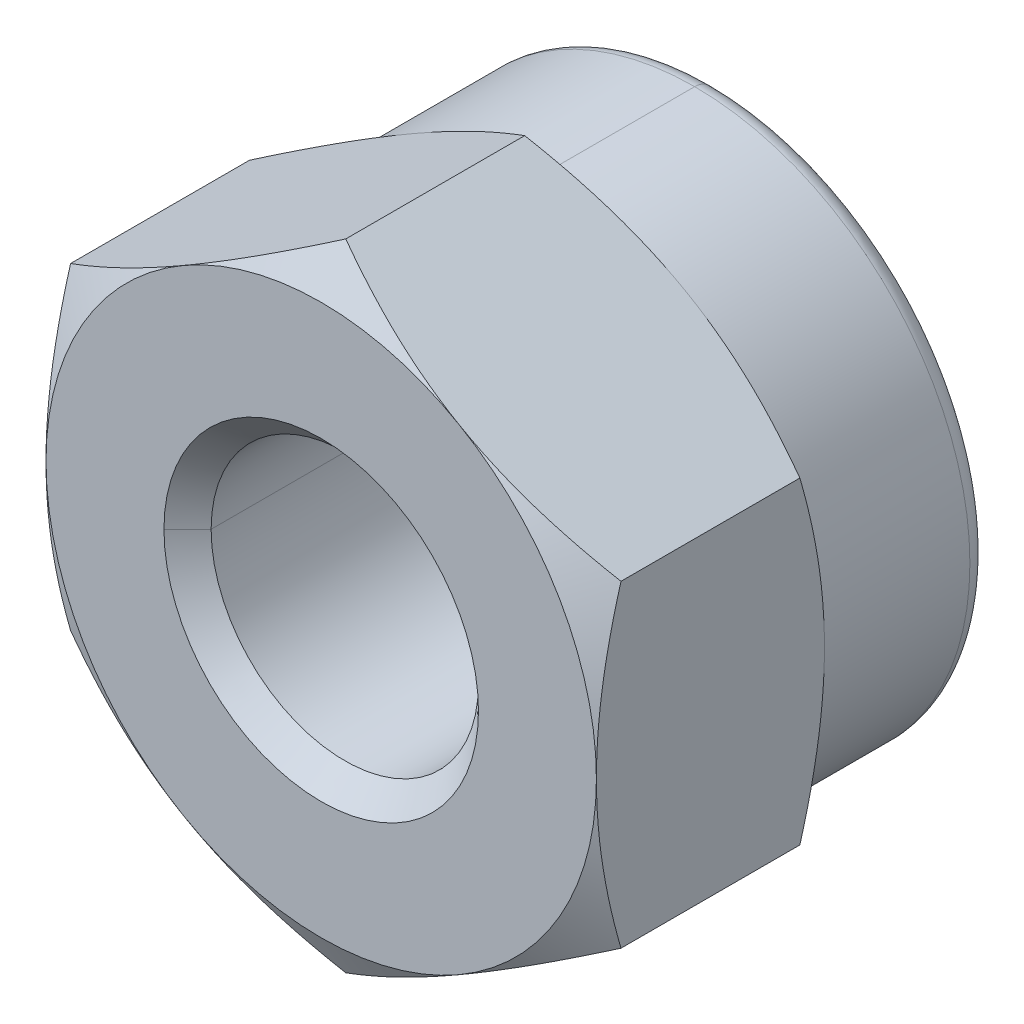
ISO-10303-21;
HEADER;
FILE_DESCRIPTION(('STEP AP214'),'2;1');
FILE_NAME('part.step','',(''),(''),'','','');
FILE_SCHEMA(('AUTOMOTIVE_DESIGN { 1 0 10303 214 1 1 1 1 }'));
ENDSEC;
DATA;
#1=APPLICATION_CONTEXT('core data for automotive mechanical design processes');
#2=APPLICATION_PROTOCOL_DEFINITION('international standard','automotive_design',2000,#1);
#3=PRODUCT_CONTEXT('',#1,'mechanical');
#4=PRODUCT('Part','Part','',(#3));
#5=PRODUCT_RELATED_PRODUCT_CATEGORY('part','',(#4));
#6=PRODUCT_DEFINITION_FORMATION('','',#4);
#7=PRODUCT_DEFINITION_CONTEXT('part definition',#1,'design');
#8=PRODUCT_DEFINITION('design','',#6,#7);
#9=PRODUCT_DEFINITION_SHAPE('','',#8);
#10=(LENGTH_UNIT() NAMED_UNIT(*) SI_UNIT(.MILLI.,.METRE.));
#11=(NAMED_UNIT(*) PLANE_ANGLE_UNIT() SI_UNIT($,.RADIAN.));
#12=(NAMED_UNIT(*) SI_UNIT($,.STERADIAN.) SOLID_ANGLE_UNIT());
#13=UNCERTAINTY_MEASURE_WITH_UNIT(LENGTH_MEASURE(1.E-05),#10,'distance_accuracy_value','');
#14=(GEOMETRIC_REPRESENTATION_CONTEXT(3) GLOBAL_UNCERTAINTY_ASSIGNED_CONTEXT((#13)) GLOBAL_UNIT_ASSIGNED_CONTEXT((#10,
#11,#12)) REPRESENTATION_CONTEXT('',''));
#15=CARTESIAN_POINT('',(0.,0.,0.));
#16=DIRECTION('',(0.,0.,1.));
#17=DIRECTION('',(1.,0.,0.));
#18=AXIS2_PLACEMENT_3D('',#15,#16,#17);
#19=CARTESIAN_POINT('',(0.,-4.041451884327,0.));
#20=DIRECTION('',(0.500000000000017,-0.866025403784429,0.));
#21=DIRECTION('',(0.,0.,1.));
#22=AXIS2_PLACEMENT_3D('',#19,#20,#21);
#23=PLANE('',#22);
#24=DIRECTION('',(0.,0.,-1.));
#25=VECTOR('',#24,1.);
#26=CARTESIAN_POINT('',(0.,-4.041451884327,-0.3126073911696));
#27=LINE('',#26,#25);
#28=CARTESIAN_POINT('',(0.,-4.041451884327,-0.3126073911696));
#29=VERTEX_POINT('',#28);
#30=CARTESIAN_POINT('',(0.,-4.041451884327,-2.58739260883));
#31=VERTEX_POINT('',#30);
#32=EDGE_CURVE('E663',#29,#31,#27,.T.);
#33=ORIENTED_EDGE('',*,*,#32,.T.);
#34=CARTESIAN_POINT('',(0.,-4.041451884327,-2.58739260883));
#35=CARTESIAN_POINT('',(0.468754219960254,-3.77081650924916,-2.74364401548528));
#36=CARTESIAN_POINT('',(0.890364330524871,-3.5273997984216,-2.82030228995144));
#37=CARTESIAN_POINT('',(1.32869092448124,-3.27433182140791,-2.9));
#38=CARTESIAN_POINT('',(1.75000000093469,-3.03108891270547,-2.9));
#39=B_SPLINE_CURVE_WITH_KNOTS('',2,(#34,#35,#36,#37,#38),.UNSPECIFIED.,.F.,.F.,(3,2,3),(0.,0.5,
1.),.UNSPECIFIED.);
#40=CARTESIAN_POINT('',(1.750000000935,-3.031088912706,-2.9));
#41=VERTEX_POINT('',#40);
#42=EDGE_CURVE('E690',#31,#41,#39,.T.);
#43=ORIENTED_EDGE('',*,*,#42,.T.);
#44=CARTESIAN_POINT('',(1.75000000093469,-3.03108891270547,-2.9));
#45=CARTESIAN_POINT('',(2.17179051889403,-2.78756804362,-2.9));
#46=CARTESIAN_POINT('',(2.60972924003531,-2.53472400508051,-2.82028490248702));
#47=CARTESIAN_POINT('',(3.03180746935427,-2.29103702576411,-2.74345678571172));
#48=CARTESIAN_POINT('',(3.49999999999966,-2.02072594216341,-2.58739260883));
#49=B_SPLINE_CURVE_WITH_KNOTS('',2,(#44,#45,#46,#47,#48),.UNSPECIFIED.,.F.,.F.,(3,2,3),(0.,0.5,
1.),.UNSPECIFIED.);
#50=CARTESIAN_POINT('',(3.5,-2.020725942164,-2.58739260883));
#51=VERTEX_POINT('',#50);
#52=EDGE_CURVE('E696',#41,#51,#49,.T.);
#53=ORIENTED_EDGE('',*,*,#52,.T.);
#54=DIRECTION('',(0.,0.,-1.));
#55=VECTOR('',#54,1.);
#56=CARTESIAN_POINT('',(3.5,-2.020725942164,-0.3126073911696));
#57=LINE('',#56,#55);
#58=CARTESIAN_POINT('',(3.5,-2.020725942164,-0.3126073911696));
#59=VERTEX_POINT('',#58);
#60=EDGE_CURVE('E741',#59,#51,#57,.T.);
#61=ORIENTED_EDGE('',*,*,#60,.F.);
#62=CARTESIAN_POINT('',(3.49999999999966,-2.02072594216341,-0.3126073911696));
#63=CARTESIAN_POINT('',(3.03124905419538,-2.29135942690642,-0.15635707590086));
#64=CARTESIAN_POINT('',(2.60964177655621,-2.53477450214371,-0.079698821264676));
#65=CARTESIAN_POINT('',(2.17131190295053,-2.78784437266382,2.514191007997E-12));
#66=CARTESIAN_POINT('',(1.75000000008146,-3.03108891319808,2.514191007997E-12));
#67=B_SPLINE_CURVE_WITH_KNOTS('',2,(#62,#63,#64,#65,#66),.UNSPECIFIED.,.F.,.F.,(3,2,3),(0.,0.5,
1.),.UNSPECIFIED.);
#68=CARTESIAN_POINT('',(1.750000000082,-3.031088913199,2.514191007997E-12));
#69=VERTEX_POINT('',#68);
#70=EDGE_CURVE('E11',#59,#69,#67,.T.);
#71=ORIENTED_EDGE('',*,*,#70,.T.);
#72=CARTESIAN_POINT('',(1.75000000008146,-3.03108891319808,2.514191007997E-12));
#73=CARTESIAN_POINT('',(1.32820711596506,-3.27461114838496,2.51419707535811E-12));
#74=CARTESIAN_POINT('',(0.890265686969895,-3.52745675030462,-0.0797160185205114));
#75=CARTESIAN_POINT('',(0.468189819572163,-3.77114236596516,-0.156544117978468));
#76=CARTESIAN_POINT('',(0.,-4.041451884327,-0.3126073911696));
#77=B_SPLINE_CURVE_WITH_KNOTS('',2,(#72,#73,#74,#75,#76),.UNSPECIFIED.,.F.,.F.,(3,2,3),(0.,0.5,
1.),.UNSPECIFIED.);
#78=EDGE_CURVE('E304',#69,#29,#77,.T.);
#79=ORIENTED_EDGE('',*,*,#78,.T.);
#80=EDGE_LOOP('',(#33,#43,#53,#61,#71,#79));
#81=FACE_BOUND('',#80,.T.);
#82=ADVANCED_FACE('F41',(#81),#23,.T.);
#83=CARTESIAN_POINT('',(0.,0.,-0.1563036955848));
#84=DIRECTION('',(0.,0.,-1.));
#85=DIRECTION('',(0.,1.,0.));
#86=AXIS2_PLACEMENT_3D('',#83,#84,#85);
#87=CONICAL_SURFACE('',#86,3.770725942164,1.0471975511964);
#88=CARTESIAN_POINT('',(0.,0.,0.));
#89=DIRECTION('',(0.,0.,-1.));
#90=DIRECTION('',(-0.500000000006301,0.866025403780801,0.));
#91=AXIS2_PLACEMENT_3D('',#88,#89,#90);
#92=CIRCLE('',#91,3.5);
#93=CARTESIAN_POINT('',(-1.750000000082,3.031088913199,2.514740225014E-12));
#94=VERTEX_POINT('',#93);
#95=CARTESIAN_POINT('',(1.749999999917,3.031088913294,2.514573731451E-12));
#96=VERTEX_POINT('',#95);
#97=EDGE_CURVE('E519',#94,#96,#92,.T.);
#98=ORIENTED_EDGE('',*,*,#97,.T.);
#99=CARTESIAN_POINT('',(3.38271077815477E-13,4.04145188432759,-0.3126073911696));
#100=CARTESIAN_POINT('',(0.468750945807665,3.77081839958282,-0.156357075900318));
#101=CARTESIAN_POINT('',(0.890358223443816,3.52740332434727,-0.079698821264676));
#102=CARTESIAN_POINT('',(1.32868809704946,3.27433345382719,2.514573731451E-12));
#103=CARTESIAN_POINT('',(1.74999999991692,3.03108891329386,2.514573731451E-12));
#104=B_SPLINE_CURVE_WITH_KNOTS('',2,(#99,#100,#101,#102,#103),.UNSPECIFIED.,.F.,.F.,(3,2,3),(0.,
0.5,1.),.UNSPECIFIED.);
#105=CARTESIAN_POINT('',(0.,4.041451884327,-0.3126073911696));
#106=VERTEX_POINT('',#105);
#107=EDGE_CURVE('E635',#106,#96,#104,.T.);
#108=ORIENTED_EDGE('',*,*,#107,.F.);
#109=CARTESIAN_POINT('',(-1.75000000008146,3.03108891319808,2.514740225014E-12));
#110=CARTESIAN_POINT('',(-1.32820711596506,3.27461114838496,2.51473917644435E-12));
#111=CARTESIAN_POINT('',(-0.890265686969895,3.52745675030462,-0.0797160185205113));
#112=CARTESIAN_POINT('',(-0.468189819572163,3.77114236596516,-0.156544117978468));
#113=CARTESIAN_POINT('',(0.,4.041451884327,-0.3126073911696));
#114=B_SPLINE_CURVE_WITH_KNOTS('',2,(#109,#110,#111,#112,#113),.UNSPECIFIED.,.F.,.F.,(3,2,3),
(0.,0.5,1.),.UNSPECIFIED.);
#115=EDGE_CURVE('E298',#94,#106,#114,.T.);
#116=ORIENTED_EDGE('',*,*,#115,.F.);
#117=EDGE_LOOP('',(#98,#108,#116));
#118=FACE_BOUND('',#117,.T.);
#119=ADVANCED_FACE('F420',(#118),#87,.T.);
#120=CARTESIAN_POINT('',(0.,0.,-0.1563036955848));
#121=DIRECTION('',(0.,0.,-1.));
#122=DIRECTION('',(0.,1.,0.));
#123=AXIS2_PLACEMENT_3D('',#120,#121,#122);
#124=CONICAL_SURFACE('',#123,3.770725942164,1.0471975511964);
#125=CARTESIAN_POINT('',(0.,0.,0.));
#126=DIRECTION('',(0.,0.,-1.));
#127=DIRECTION('',(0.4999999999921,0.866025403789,0.));
#128=AXIS2_PLACEMENT_3D('',#125,#126,#127);
#129=CIRCLE('',#128,3.5);
#130=CARTESIAN_POINT('',(3.500000000001,9.741384622713E-11,2.514711208266E-12));
#131=VERTEX_POINT('',#130);
#132=EDGE_CURVE('E516',#96,#131,#129,.T.);
#133=ORIENTED_EDGE('',*,*,#132,.T.);
#134=CARTESIAN_POINT('',(3.5,2.020725942164,-0.3126073911696));
#135=CARTESIAN_POINT('',(3.5,1.47945897266761,-0.156357075899246));
#136=CARTESIAN_POINT('',(3.5,0.992628822203235,-0.079698821264676));
#137=CARTESIAN_POINT('',(3.5,0.486489081162981,2.514711208266E-12));
#138=CARTESIAN_POINT('',(3.5,9.74151315169536E-11,2.514711208266E-12));
#139=B_SPLINE_CURVE_WITH_KNOTS('',2,(#134,#135,#136,#137,#138),.UNSPECIFIED.,.F.,.F.,(3,2,3),
(0.,0.5,1.),.UNSPECIFIED.);
#140=CARTESIAN_POINT('',(3.5,2.020725942164,-0.3126073911696));
#141=VERTEX_POINT('',#140);
#142=EDGE_CURVE('E485',#141,#131,#139,.T.);
#143=ORIENTED_EDGE('',*,*,#142,.F.);
#144=CARTESIAN_POINT('',(1.74999999991692,3.03108891329386,2.514573731451E-12));
#145=CARTESIAN_POINT('',(2.1717928840349,2.78756667810606,2.51457654611848E-12));
#146=CARTESIAN_POINT('',(2.60973431303007,2.5347210761864,-0.0797160185205113));
#147=CARTESIAN_POINT('',(3.03181018043036,2.29103546052439,-0.156544117978931));
#148=CARTESIAN_POINT('',(3.5,2.020725942164,-0.3126073911696));
#149=B_SPLINE_CURVE_WITH_KNOTS('',2,(#144,#145,#146,#147,#148),.UNSPECIFIED.,.F.,.F.,(3,2,3),
(0.,0.5,1.),.UNSPECIFIED.);
#150=EDGE_CURVE('E484',#96,#141,#149,.T.);
#151=ORIENTED_EDGE('',*,*,#150,.F.);
#152=EDGE_LOOP('',(#133,#143,#151));
#153=FACE_BOUND('',#152,.T.);
#154=ADVANCED_FACE('F334',(#153),#124,.T.);
#155=CARTESIAN_POINT('',(0.,0.,-0.1563036955848));
#156=DIRECTION('',(0.,0.,-1.));
#157=DIRECTION('',(0.,1.,0.));
#158=AXIS2_PLACEMENT_3D('',#155,#156,#157);
#159=CONICAL_SURFACE('',#158,3.770725942164,1.0471975511964);
#160=CARTESIAN_POINT('',(0.,0.,0.));
#161=DIRECTION('',(0.,0.,-1.));
#162=DIRECTION('',(1.,1.11301302548E-11,0.));
#163=AXIS2_PLACEMENT_3D('',#160,#161,#162);
#164=CIRCLE('',#163,3.5);
#165=EDGE_CURVE('E518',#131,#69,#164,.T.);
#166=ORIENTED_EDGE('',*,*,#165,.T.);
#167=ORIENTED_EDGE('',*,*,#70,.F.);
#168=CARTESIAN_POINT('',(3.5,9.74151315169536E-11,2.514711208266E-12));
#169=CARTESIAN_POINT('',(3.5,-0.48704447027913,2.51471207139004E-12));
#170=CARTESIAN_POINT('',(3.5,-0.992735674118364,-0.0797160185205113));
#171=CARTESIAN_POINT('',(3.5,-1.48010690543422,-0.156544117977658));
#172=CARTESIAN_POINT('',(3.5,-2.020725942164,-0.3126073911696));
#173=B_SPLINE_CURVE_WITH_KNOTS('',2,(#168,#169,#170,#171,#172),.UNSPECIFIED.,.F.,.F.,(3,2,3),
(0.,0.5,1.),.UNSPECIFIED.);
#174=EDGE_CURVE('E357',#131,#59,#173,.T.);
#175=ORIENTED_EDGE('',*,*,#174,.F.);
#176=EDGE_LOOP('',(#166,#167,#175));
#177=FACE_BOUND('',#176,.T.);
#178=ADVANCED_FACE('F323',(#177),#159,.T.);
#179=CARTESIAN_POINT('',(0.,0.,-0.1563036955848));
#180=DIRECTION('',(0.,0.,-1.));
#181=DIRECTION('',(0.,1.,0.));
#182=AXIS2_PLACEMENT_3D('',#179,#180,#181);
#183=CONICAL_SURFACE('',#182,3.770725942164,1.0471975511964);
#184=CARTESIAN_POINT('',(0.,0.,0.));
#185=DIRECTION('',(0.,0.,-1.));
#186=DIRECTION('',(-1.,-1.112949645045E-11,0.));
#187=AXIS2_PLACEMENT_3D('',#184,#185,#186);
#188=CIRCLE('',#187,3.5);
#189=CARTESIAN_POINT('',(-3.500000000001,-9.741241120132E-11,2.514713018323E-12));
#190=VERTEX_POINT('',#189);
#191=EDGE_CURVE('E527',#190,#94,#188,.T.);
#192=ORIENTED_EDGE('',*,*,#191,.T.);
#193=CARTESIAN_POINT('',(-3.49999999999966,2.02072594216341,-0.3126073911696));
#194=CARTESIAN_POINT('',(-3.03124905419546,2.29135942690637,-0.156357075900886));
#195=CARTESIAN_POINT('',(-2.60964177655621,2.53477450214371,-0.079698821264676));
#196=CARTESIAN_POINT('',(-2.17131190295059,2.78784437266378,2.514740225014E-12));
#197=CARTESIAN_POINT('',(-1.75000000008146,3.03108891319808,2.514740225014E-12));
#198=B_SPLINE_CURVE_WITH_KNOTS('',2,(#193,#194,#195,#196,#197),.UNSPECIFIED.,.F.,.F.,(3,2,3),
(0.,0.5,1.),.UNSPECIFIED.);
#199=CARTESIAN_POINT('',(-3.5,2.020725942164,-0.3126073911696));
#200=VERTEX_POINT('',#199);
#201=EDGE_CURVE('E850',#200,#94,#198,.T.);
#202=ORIENTED_EDGE('',*,*,#201,.F.);
#203=CARTESIAN_POINT('',(-3.5,-9.74099273465256E-11,2.514713018323E-12));
#204=CARTESIAN_POINT('',(-3.5,0.48704447027913,2.51471207139004E-12));
#205=CARTESIAN_POINT('',(-3.5,0.992735674118364,-0.0797160185205113));
#206=CARTESIAN_POINT('',(-3.5,1.48010690543422,-0.156544117977658));
#207=CARTESIAN_POINT('',(-3.5,2.020725942164,-0.3126073911696));
#208=B_SPLINE_CURVE_WITH_KNOTS('',2,(#203,#204,#205,#206,#207),.UNSPECIFIED.,.F.,.F.,(3,2,3),
(0.,0.5,1.),.UNSPECIFIED.);
#209=EDGE_CURVE('E849',#190,#200,#208,.T.);
#210=ORIENTED_EDGE('',*,*,#209,.F.);
#211=EDGE_LOOP('',(#192,#202,#210));
#212=FACE_BOUND('',#211,.T.);
#213=ADVANCED_FACE('F333',(#212),#183,.T.);
#214=CARTESIAN_POINT('',(0.,0.,-0.1563036955848));
#215=DIRECTION('',(0.,0.,-1.));
#216=DIRECTION('',(0.,1.,0.));
#217=AXIS2_PLACEMENT_3D('',#214,#215,#216);
#218=CONICAL_SURFACE('',#217,3.770725942164,1.0471975511964);
#219=CARTESIAN_POINT('',(0.,0.,0.));
#220=DIRECTION('',(0.,0.,-1.));
#221=DIRECTION('',(-0.4999999999921,-0.866025403789,0.));
#222=AXIS2_PLACEMENT_3D('',#219,#220,#221);
#223=CIRCLE('',#222,3.5);
#224=CARTESIAN_POINT('',(-1.749999999917,-3.031088913294,2.514308188617E-12));
#225=VERTEX_POINT('',#224);
#226=EDGE_CURVE('E538',#225,#190,#223,.T.);
#227=ORIENTED_EDGE('',*,*,#226,.T.);
#228=CARTESIAN_POINT('',(-3.5,-2.020725942164,-0.3126073911696));
#229=CARTESIAN_POINT('',(-3.5,-1.47945897266761,-0.156357075899246));
#230=CARTESIAN_POINT('',(-3.5,-0.992628822203235,-0.079698821264676));
#231=CARTESIAN_POINT('',(-3.5,-0.486489081162981,2.514713018323E-12));
#232=CARTESIAN_POINT('',(-3.5,-9.74099273465256E-11,2.514713018323E-12));
#233=B_SPLINE_CURVE_WITH_KNOTS('',2,(#228,#229,#230,#231,#232),.UNSPECIFIED.,.F.,.F.,(3,2,3),
(0.,0.5,1.),.UNSPECIFIED.);
#234=CARTESIAN_POINT('',(-3.5,-2.020725942164,-0.3126073911696));
#235=VERTEX_POINT('',#234);
#236=EDGE_CURVE('E55',#235,#190,#233,.T.);
#237=ORIENTED_EDGE('',*,*,#236,.F.);
#238=CARTESIAN_POINT('',(-1.74999999991692,-3.03108891329386,2.514308188617E-12));
#239=CARTESIAN_POINT('',(-2.1717928840349,-2.78756667810606,2.51430549557536E-12));
#240=CARTESIAN_POINT('',(-2.60973431303007,-2.5347210761864,-0.0797160185205114));
#241=CARTESIAN_POINT('',(-3.03181018043036,-2.29103546052439,-0.156544117978931));
#242=CARTESIAN_POINT('',(-3.5,-2.020725942164,-0.3126073911696));
#243=B_SPLINE_CURVE_WITH_KNOTS('',2,(#238,#239,#240,#241,#242),.UNSPECIFIED.,.F.,.F.,(3,2,3),
(0.,0.5,1.),.UNSPECIFIED.);
#244=EDGE_CURVE('E670',#225,#235,#243,.T.);
#245=ORIENTED_EDGE('',*,*,#244,.F.);
#246=EDGE_LOOP('',(#227,#237,#245));
#247=FACE_BOUND('',#246,.T.);
#248=ADVANCED_FACE('F338',(#247),#218,.T.);
#249=CARTESIAN_POINT('',(-3.5,2.020725942164,0.));
#250=DIRECTION('',(-1.,0.,0.));
#251=DIRECTION('',(0.,0.,-1.));
#252=AXIS2_PLACEMENT_3D('',#249,#250,#251);
#253=PLANE('',#252);
#254=DIRECTION('',(0.,0.,-1.));
#255=VECTOR('',#254,1.);
#256=CARTESIAN_POINT('',(-3.5,2.020725942164,-0.3126073911696));
#257=LINE('',#256,#255);
#258=CARTESIAN_POINT('',(-3.5,2.020725942164,-2.58739260883));
#259=VERTEX_POINT('',#258);
#260=EDGE_CURVE('E66',#200,#259,#257,.T.);
#261=ORIENTED_EDGE('',*,*,#260,.T.);
#262=CARTESIAN_POINT('',(-3.5,2.020725942164,-2.58739260883));
#263=CARTESIAN_POINT('',(-3.5,1.47945519202103,-2.74364401548082));
#264=CARTESIAN_POINT('',(-3.5,0.992621770389918,-2.82030228995144));
#265=CARTESIAN_POINT('',(-3.5,0.48648581641694,-2.9));
#266=CARTESIAN_POINT('',(-3.5,5.42491399024847E-12,-2.9));
#267=B_SPLINE_CURVE_WITH_KNOTS('',2,(#262,#263,#264,#265,#266),.UNSPECIFIED.,.F.,.F.,(3,2,3),
(0.,0.5,1.),.UNSPECIFIED.);
#268=CARTESIAN_POINT('',(-3.5,5.423623404431E-12,-2.9));
#269=VERTEX_POINT('',#268);
#270=EDGE_CURVE('E600',#259,#269,#267,.T.);
#271=ORIENTED_EDGE('',*,*,#270,.T.);
#272=CARTESIAN_POINT('',(-3.5,5.42491399024847E-12,-2.9));
#273=CARTESIAN_POINT('',(-3.5,-0.48704173915879,-2.9));
#274=CARTESIAN_POINT('',(-3.5,-0.992729816292355,-2.82028490248702));
#275=CARTESIAN_POINT('',(-3.5,-1.48010377493442,-2.74345678571855));
#276=CARTESIAN_POINT('',(-3.5,-2.020725942164,-2.58739260883));
#277=B_SPLINE_CURVE_WITH_KNOTS('',2,(#272,#273,#274,#275,#276),.UNSPECIFIED.,.F.,.F.,(3,2,3),
(0.,0.5,1.),.UNSPECIFIED.);
#278=CARTESIAN_POINT('',(-3.5,-2.020725942164,-2.58739260883));
#279=VERTEX_POINT('',#278);
#280=EDGE_CURVE('E704',#269,#279,#277,.T.);
#281=ORIENTED_EDGE('',*,*,#280,.T.);
#282=DIRECTION('',(0.,0.,-1.));
#283=VECTOR('',#282,1.);
#284=CARTESIAN_POINT('',(-3.5,-2.020725942164,-0.3126073911696));
#285=LINE('',#284,#283);
#286=EDGE_CURVE('E679',#235,#279,#285,.T.);
#287=ORIENTED_EDGE('',*,*,#286,.F.);
#288=ORIENTED_EDGE('',*,*,#236,.T.);
#289=ORIENTED_EDGE('',*,*,#209,.T.);
#290=EDGE_LOOP('',(#261,#271,#281,#287,#288,#289));
#291=FACE_BOUND('',#290,.T.);
#292=ADVANCED_FACE('F573',(#291),#253,.T.);
#293=CARTESIAN_POINT('',(0.,4.041451884327,0.));
#294=DIRECTION('',(-0.500000000000017,0.866025403784429,0.));
#295=DIRECTION('',(0.,0.,-1.));
#296=AXIS2_PLACEMENT_3D('',#293,#294,#295);
#297=PLANE('',#296);
#298=DIRECTION('',(0.,0.,-1.));
#299=VECTOR('',#298,1.);
#300=CARTESIAN_POINT('',(0.,4.041451884327,-0.3126073911696));
#301=LINE('',#300,#299);
#302=CARTESIAN_POINT('',(0.,4.041451884327,-2.58739260883));
#303=VERTEX_POINT('',#302);
#304=EDGE_CURVE('E562',#106,#303,#301,.T.);
#305=ORIENTED_EDGE('',*,*,#304,.T.);
#306=CARTESIAN_POINT('',(0.,4.041451884327,-2.58739260883));
#307=CARTESIAN_POINT('',(-0.468754219960254,3.77081650924916,-2.74364401548528));
#308=CARTESIAN_POINT('',(-0.890364330524871,3.5273997984216,-2.82030228995144));
#309=CARTESIAN_POINT('',(-1.32869092448124,3.27433182140791,-2.9));
#310=CARTESIAN_POINT('',(-1.75000000093469,3.03108891270547,-2.9));
#311=B_SPLINE_CURVE_WITH_KNOTS('',2,(#306,#307,#308,#309,#310),.UNSPECIFIED.,.F.,.F.,(3,2,3),
(0.,0.5,1.),.UNSPECIFIED.);
#312=CARTESIAN_POINT('',(-1.750000000935,3.031088912706,-2.9));
#313=VERTEX_POINT('',#312);
#314=EDGE_CURVE('E593',#303,#313,#311,.T.);
#315=ORIENTED_EDGE('',*,*,#314,.T.);
#316=CARTESIAN_POINT('',(-1.75000000093469,3.03108891270547,-2.9));
#317=CARTESIAN_POINT('',(-2.17179051889403,2.78756804362,-2.9));
#318=CARTESIAN_POINT('',(-2.60972924003531,2.53472400508051,-2.82028490248702));
#319=CARTESIAN_POINT('',(-3.03180746935427,2.29103702576411,-2.74345678571172));
#320=CARTESIAN_POINT('',(-3.49999999999966,2.02072594216341,-2.58739260883));
#321=B_SPLINE_CURVE_WITH_KNOTS('',2,(#316,#317,#318,#319,#320),.UNSPECIFIED.,.F.,.F.,(3,2,3),
(0.,0.5,1.),.UNSPECIFIED.);
#322=EDGE_CURVE('E599',#313,#259,#321,.T.);
#323=ORIENTED_EDGE('',*,*,#322,.T.);
#324=ORIENTED_EDGE('',*,*,#260,.F.);
#325=ORIENTED_EDGE('',*,*,#201,.T.);
#326=ORIENTED_EDGE('',*,*,#115,.T.);
#327=EDGE_LOOP('',(#305,#315,#323,#324,#325,#326));
#328=FACE_BOUND('',#327,.T.);
#329=ADVANCED_FACE('F564',(#328),#297,.T.);
#330=CARTESIAN_POINT('',(0.,0.,-2.9));
#331=DIRECTION('',(0.,0.,1.));
#332=DIRECTION('',(0.,1.,0.));
#333=AXIS2_PLACEMENT_3D('',#330,#331,#332);
#334=CYLINDRICAL_SURFACE('',#333,3.5);
#335=DIRECTION('',(6.201146020945E-13,0.,-1.));
#336=VECTOR('',#335,1.);
#337=CARTESIAN_POINT('',(0.,3.5,-2.9));
#338=LINE('',#337,#336);
#339=CARTESIAN_POINT('',(0.,3.5,-2.9));
#340=VERTEX_POINT('',#339);
#341=CARTESIAN_POINT('',(0.,3.5,-4.75));
#342=VERTEX_POINT('',#341);
#343=EDGE_CURVE('E258',#340,#342,#338,.T.);
#344=ORIENTED_EDGE('',*,*,#343,.T.);
#345=CARTESIAN_POINT('',(0.,0.,-4.75));
#346=DIRECTION('',(0.,0.,1.));
#347=DIRECTION('',(0.,1.,0.));
#348=AXIS2_PLACEMENT_3D('',#345,#346,#347);
#349=CIRCLE('',#348,3.5);
#350=CARTESIAN_POINT('',(0.,-3.5,-4.75));
#351=VERTEX_POINT('',#350);
#352=EDGE_CURVE('E287',#342,#351,#349,.T.);
#353=ORIENTED_EDGE('',*,*,#352,.T.);
#354=DIRECTION('',(-6.209086765224E-13,0.,-1.));
#355=VECTOR('',#354,1.);
#356=CARTESIAN_POINT('',(0.,-3.5,-2.9));
#357=LINE('',#356,#355);
#358=CARTESIAN_POINT('',(0.,-3.5,-2.9));
#359=VERTEX_POINT('',#358);
#360=EDGE_CURVE('E263',#359,#351,#357,.T.);
#361=ORIENTED_EDGE('',*,*,#360,.F.);
#362=CARTESIAN_POINT('',(0.,0.,-2.9));
#363=DIRECTION('',(0.,0.,1.));
#364=DIRECTION('',(-0.500000001073985,-0.866025403164373,0.));
#365=AXIS2_PLACEMENT_3D('',#362,#363,#364);
#366=CIRCLE('',#365,3.5);
#367=CARTESIAN_POINT('',(-1.750000000944,-3.0310889127,-2.9));
#368=VERTEX_POINT('',#367);
#369=EDGE_CURVE('E689',#368,#359,#366,.T.);
#370=ORIENTED_EDGE('',*,*,#369,.F.);
#371=CARTESIAN_POINT('',(0.,0.,-2.9));
#372=DIRECTION('',(0.,0.,1.));
#373=DIRECTION('',(-1.,0.,0.));
#374=AXIS2_PLACEMENT_3D('',#371,#372,#373);
#375=CIRCLE('',#374,3.5);
#376=EDGE_CURVE('E771',#269,#368,#375,.T.);
#377=ORIENTED_EDGE('',*,*,#376,.F.);
#378=CARTESIAN_POINT('',(0.,0.,-2.9));
#379=DIRECTION('',(0.,0.,1.));
#380=DIRECTION('',(-0.500000001073985,0.866025403164373,0.));
#381=AXIS2_PLACEMENT_3D('',#378,#379,#380);
#382=CIRCLE('',#381,3.5);
#383=EDGE_CURVE('E596',#313,#269,#382,.T.);
#384=ORIENTED_EDGE('',*,*,#383,.F.);
#385=CARTESIAN_POINT('',(0.,0.,-2.9));
#386=DIRECTION('',(0.,0.,1.));
#387=DIRECTION('',(0.,1.,0.));
#388=AXIS2_PLACEMENT_3D('',#385,#386,#387);
#389=CIRCLE('',#388,3.5);
#390=EDGE_CURVE('E585',#340,#313,#389,.T.);
#391=ORIENTED_EDGE('',*,*,#390,.F.);
#392=EDGE_LOOP('',(#344,#353,#361,#370,#377,#384,#391));
#393=FACE_BOUND('',#392,.T.);
#394=ADVANCED_FACE('F572',(#393),#334,.T.);
#395=CARTESIAN_POINT('',(0.,0.,-4.75));
#396=DIRECTION('',(0.,0.,1.));
#397=DIRECTION('',(0.0077863199104977,0.999969686151661,0.));
#398=AXIS2_PLACEMENT_3D('',#395,#396,#397);
#399=TOROIDAL_SURFACE('',#398,3.25,0.25);
#400=CARTESIAN_POINT('',(0.,3.25,-4.75));
#401=DIRECTION('',(1.,0.,0.));
#402=DIRECTION('',(0.,0.,-1.));
#403=AXIS2_PLACEMENT_3D('',#400,#401,#402);
#404=CIRCLE('',#403,0.25);
#405=CARTESIAN_POINT('',(0.,3.25,-5.));
#406=VERTEX_POINT('',#405);
#407=EDGE_CURVE('E272',#406,#342,#404,.T.);
#408=ORIENTED_EDGE('',*,*,#407,.F.);
#409=CARTESIAN_POINT('',(0.,0.,-5.));
#410=DIRECTION('',(0.,0.,1.));
#411=DIRECTION('',(0.,1.,0.));
#412=AXIS2_PLACEMENT_3D('',#409,#410,#411);
#413=CIRCLE('',#412,3.25);
#414=CARTESIAN_POINT('',(0.,-3.25,-5.));
#415=VERTEX_POINT('',#414);
#416=EDGE_CURVE('E275',#406,#415,#413,.T.);
#417=ORIENTED_EDGE('',*,*,#416,.T.);
#418=CARTESIAN_POINT('',(0.,-3.25,-4.75));
#419=DIRECTION('',(-1.,0.,0.));
#420=DIRECTION('',(0.,0.,-1.));
#421=AXIS2_PLACEMENT_3D('',#418,#419,#420);
#422=CIRCLE('',#421,0.25);
#423=EDGE_CURVE('E268',#415,#351,#422,.T.);
#424=ORIENTED_EDGE('',*,*,#423,.T.);
#425=ORIENTED_EDGE('',*,*,#352,.F.);
#426=EDGE_LOOP('',(#408,#417,#424,#425));
#427=FACE_BOUND('',#426,.T.);
#428=ADVANCED_FACE('F455',(#427),#399,.T.);
#429=CARTESIAN_POINT('',(0.,0.,0.));
#430=DIRECTION('',(0.,0.,-1.));
#431=DIRECTION('',(1.,0.,0.));
#432=AXIS2_PLACEMENT_3D('',#429,#430,#431);
#433=CYLINDRICAL_SURFACE('',#432,1.7);
#434=DIRECTION('',(0.,0.,-1.));
#435=VECTOR('',#434,1.);
#436=CARTESIAN_POINT('',(1.700000253009,5.158769557422E-10,-0.3000002531422));
#437=LINE('',#436,#435);
#438=CARTESIAN_POINT('',(1.7,0.,-0.2999992216432));
#439=VERTEX_POINT('',#438);
#440=CARTESIAN_POINT('',(1.7,0.,-4.700000778357));
#441=VERTEX_POINT('',#440);
#442=EDGE_CURVE('E241',#439,#441,#437,.T.);
#443=ORIENTED_EDGE('',*,*,#442,.F.);
#444=CARTESIAN_POINT('',(0.,0.,-0.2999992216432));
#445=DIRECTION('',(0.,0.,1.));
#446=DIRECTION('',(1.,0.,0.));
#447=AXIS2_PLACEMENT_3D('',#444,#445,#446);
#448=CIRCLE('',#447,1.7);
#449=CARTESIAN_POINT('',(-1.7,0.,-0.2999992216432));
#450=VERTEX_POINT('',#449);
#451=EDGE_CURVE('E284',#439,#450,#448,.T.);
#452=ORIENTED_EDGE('',*,*,#451,.T.);
#453=DIRECTION('',(0.,0.,-1.));
#454=VECTOR('',#453,1.);
#455=CARTESIAN_POINT('',(-1.700000253009,-5.158771965276E-10,-0.3000002531422));
#456=LINE('',#455,#454);
#457=CARTESIAN_POINT('',(-1.7,0.,-4.700000778357));
#458=VERTEX_POINT('',#457);
#459=EDGE_CURVE('E235',#450,#458,#456,.T.);
#460=ORIENTED_EDGE('',*,*,#459,.T.);
#461=CARTESIAN_POINT('',(0.,0.,-4.700000778357));
#462=DIRECTION('',(0.,0.,-1.));
#463=DIRECTION('',(-1.,0.,0.));
#464=AXIS2_PLACEMENT_3D('',#461,#462,#463);
#465=CIRCLE('',#464,1.7);
#466=EDGE_CURVE('E219',#458,#441,#465,.T.);
#467=ORIENTED_EDGE('',*,*,#466,.T.);
#468=EDGE_LOOP('',(#443,#452,#460,#467));
#469=FACE_BOUND('',#468,.T.);
#470=ADVANCED_FACE('F239',(#469),#433,.F.);
#471=CARTESIAN_POINT('',(0.,0.,-0.1500004552722));
#472=DIRECTION('',(0.,0.,1.));
#473=DIRECTION('',(0.,-1.,0.));
#474=AXIS2_PLACEMENT_3D('',#471,#472,#473);
#475=CONICAL_SURFACE('',#474,1.85000064635,0.785398461133017);
#476=DIRECTION('',(-0.707107120375266,-6.91414270609267E-10,-0.707106441997666));
#477=VECTOR('',#476,1.);
#478=CARTESIAN_POINT('',(2.000000396876,8.092191873193E-10,-3.970858270345E-07));
#479=LINE('',#478,#477);
#480=CARTESIAN_POINT('',(2.000000142678,0.,-1.048264307357E-06));
#481=VERTEX_POINT('',#480);
#482=EDGE_CURVE('E267',#481,#439,#479,.T.);
#483=ORIENTED_EDGE('',*,*,#482,.F.);
#484=CARTESIAN_POINT('',(0.,0.,-1.048264307357E-06));
#485=DIRECTION('',(0.,0.,1.));
#486=DIRECTION('',(1.,0.,0.));
#487=AXIS2_PLACEMENT_3D('',#484,#485,#486);
#488=CIRCLE('',#487,2.000000142678);
#489=CARTESIAN_POINT('',(-2.000000142678,0.,-1.048264307357E-06));
#490=VERTEX_POINT('',#489);
#491=EDGE_CURVE('E293',#481,#490,#488,.T.);
#492=ORIENTED_EDGE('',*,*,#491,.T.);
#493=DIRECTION('',(0.707107120375266,6.91413633824867E-10,-0.707106441997666));
#494=VECTOR('',#493,1.);
#495=CARTESIAN_POINT('',(-2.000000396876,-8.092191579399E-10,-3.970858265164E-07));
#496=LINE('',#495,#494);
#497=EDGE_CURVE('E252',#490,#450,#496,.T.);
#498=ORIENTED_EDGE('',*,*,#497,.T.);
#499=ORIENTED_EDGE('',*,*,#451,.F.);
#500=EDGE_LOOP('',(#483,#492,#498,#499));
#501=FACE_BOUND('',#500,.T.);
#502=ADVANCED_FACE('F618',(#501),#475,.F.);
#503=CARTESIAN_POINT('',(0.,0.,-0.1500004552722));
#504=DIRECTION('',(0.,0.,1.));
#505=DIRECTION('',(0.,-1.,0.));
#506=AXIS2_PLACEMENT_3D('',#503,#504,#505);
#507=CONICAL_SURFACE('',#506,1.85000064635,0.785398461133017);
#508=ORIENTED_EDGE('',*,*,#497,.F.);
#509=CARTESIAN_POINT('',(0.,0.,-1.048264307357E-06));
#510=DIRECTION('',(0.,0.,1.));
#511=DIRECTION('',(-1.,0.,0.));
#512=AXIS2_PLACEMENT_3D('',#509,#510,#511);
#513=CIRCLE('',#512,2.000000142678);
#514=EDGE_CURVE('E290',#490,#481,#513,.T.);
#515=ORIENTED_EDGE('',*,*,#514,.T.);
#516=ORIENTED_EDGE('',*,*,#482,.T.);
#517=CARTESIAN_POINT('',(0.,0.,-0.2999992216432));
#518=DIRECTION('',(0.,0.,1.));
#519=DIRECTION('',(-1.,0.,0.));
#520=AXIS2_PLACEMENT_3D('',#517,#518,#519);
#521=CIRCLE('',#520,1.7);
#522=EDGE_CURVE('E245',#450,#439,#521,.T.);
#523=ORIENTED_EDGE('',*,*,#522,.F.);
#524=EDGE_LOOP('',(#508,#515,#516,#523));
#525=FACE_BOUND('',#524,.T.);
#526=ADVANCED_FACE('F376',(#525),#507,.F.);
#527=CARTESIAN_POINT('',(0.,0.,0.));
#528=DIRECTION('',(0.,0.,-1.));
#529=DIRECTION('',(1.,0.,0.));
#530=AXIS2_PLACEMENT_3D('',#527,#528,#529);
#531=CYLINDRICAL_SURFACE('',#530,1.7);
#532=ORIENTED_EDGE('',*,*,#459,.F.);
#533=ORIENTED_EDGE('',*,*,#522,.T.);
#534=ORIENTED_EDGE('',*,*,#442,.T.);
#535=CARTESIAN_POINT('',(0.,0.,-4.700000778357));
#536=DIRECTION('',(0.,0.,-1.));
#537=DIRECTION('',(1.,0.,0.));
#538=AXIS2_PLACEMENT_3D('',#535,#536,#537);
#539=CIRCLE('',#538,1.7);
#540=EDGE_CURVE('E226',#441,#458,#539,.T.);
#541=ORIENTED_EDGE('',*,*,#540,.T.);
#542=EDGE_LOOP('',(#532,#533,#534,#541));
#543=FACE_BOUND('',#542,.T.);
#544=ADVANCED_FACE('F244',(#543),#531,.F.);
#545=CARTESIAN_POINT('',(0.,0.,-4.849999544728));
#546=DIRECTION('',(0.,0.,-1.));
#547=DIRECTION('',(0.,-1.,0.));
#548=AXIS2_PLACEMENT_3D('',#545,#546,#547);
#549=CONICAL_SURFACE('',#548,1.85000064635,0.785398461133017);
#550=DIRECTION('',(-0.707107120375266,-6.91415070728467E-10,0.707106441997666));
#551=VECTOR('',#550,1.);
#552=CARTESIAN_POINT('',(2.000000396876,8.092198348681E-10,-4.999999602914));
#553=LINE('',#552,#551);
#554=CARTESIAN_POINT('',(2.000000142678,0.,-4.999998951736));
#555=VERTEX_POINT('',#554);
#556=EDGE_CURVE('E214',#555,#441,#553,.T.);
#557=ORIENTED_EDGE('',*,*,#556,.F.);
#558=CARTESIAN_POINT('',(0.,0.,-4.999998951736));
#559=DIRECTION('',(0.,0.,-1.));
#560=DIRECTION('',(1.,0.,0.));
#561=AXIS2_PLACEMENT_3D('',#558,#559,#560);
#562=CIRCLE('',#561,2.000000142678);
#563=CARTESIAN_POINT('',(-2.000000142678,0.,-4.999998951736));
#564=VERTEX_POINT('',#563);
#565=EDGE_CURVE('E282',#555,#564,#562,.T.);
#566=ORIENTED_EDGE('',*,*,#565,.T.);
#567=DIRECTION('',(0.707107120375266,6.91414037155467E-10,0.707106441997666));
#568=VECTOR('',#567,1.);
#569=CARTESIAN_POINT('',(-2.000000396876,-8.092193984475E-10,-4.999999602914));
#570=LINE('',#569,#568);
#571=EDGE_CURVE('E230',#564,#458,#570,.T.);
#572=ORIENTED_EDGE('',*,*,#571,.T.);
#573=ORIENTED_EDGE('',*,*,#540,.F.);
#574=EDGE_LOOP('',(#557,#566,#572,#573));
#575=FACE_BOUND('',#574,.T.);
#576=ADVANCED_FACE('F229',(#575),#549,.F.);
#577=CARTESIAN_POINT('',(0.,0.,-4.849999544728));
#578=DIRECTION('',(0.,0.,-1.));
#579=DIRECTION('',(0.,-1.,0.));
#580=AXIS2_PLACEMENT_3D('',#577,#578,#579);
#581=CONICAL_SURFACE('',#580,1.85000064635,0.785398461133017);
#582=ORIENTED_EDGE('',*,*,#571,.F.);
#583=CARTESIAN_POINT('',(0.,0.,-4.999998951736));
#584=DIRECTION('',(0.,0.,-1.));
#585=DIRECTION('',(-1.,0.,0.));
#586=AXIS2_PLACEMENT_3D('',#583,#584,#585);
#587=CIRCLE('',#586,2.000000142678);
#588=EDGE_CURVE('E221',#564,#555,#587,.T.);
#589=ORIENTED_EDGE('',*,*,#588,.T.);
#590=ORIENTED_EDGE('',*,*,#556,.T.);
#591=ORIENTED_EDGE('',*,*,#466,.F.);
#592=EDGE_LOOP('',(#582,#589,#590,#591));
#593=FACE_BOUND('',#592,.T.);
#594=ADVANCED_FACE('F217',(#593),#581,.F.);
#595=CARTESIAN_POINT('',(0.,0.,-5.));
#596=DIRECTION('',(0.,0.,-1.));
#597=DIRECTION('',(1.,0.,0.));
#598=AXIS2_PLACEMENT_3D('',#595,#596,#597);
#599=PLANE('',#598);
#600=ORIENTED_EDGE('',*,*,#565,.F.);
#601=ORIENTED_EDGE('',*,*,#588,.F.);
#602=EDGE_LOOP('',(#600,#601));
#603=FACE_BOUND('',#602,.T.);
#604=ORIENTED_EDGE('',*,*,#416,.F.);
#605=CARTESIAN_POINT('',(0.,0.,-5.));
#606=DIRECTION('',(0.,0.,1.));
#607=DIRECTION('',(0.,-1.,0.));
#608=AXIS2_PLACEMENT_3D('',#605,#606,#607);
#609=CIRCLE('',#608,3.25);
#610=EDGE_CURVE('E273',#415,#406,#609,.T.);
#611=ORIENTED_EDGE('',*,*,#610,.F.);
#612=EDGE_LOOP('',(#604,#611));
#613=FACE_BOUND('',#612,.T.);
#614=ADVANCED_FACE('F418',(#603,#613),#599,.T.);
#615=CARTESIAN_POINT('',(0.,0.,-4.75));
#616=DIRECTION('',(0.,0.,1.));
#617=DIRECTION('',(-0.0077863199104977,-0.999969686151661,0.));
#618=AXIS2_PLACEMENT_3D('',#615,#616,#617);
#619=TOROIDAL_SURFACE('',#618,3.25,0.25);
#620=ORIENTED_EDGE('',*,*,#423,.F.);
#621=ORIENTED_EDGE('',*,*,#610,.T.);
#622=ORIENTED_EDGE('',*,*,#407,.T.);
#623=CARTESIAN_POINT('',(0.,0.,-4.75));
#624=DIRECTION('',(0.,0.,1.));
#625=DIRECTION('',(0.,-1.,0.));
#626=AXIS2_PLACEMENT_3D('',#623,#624,#625);
#627=CIRCLE('',#626,3.5);
#628=EDGE_CURVE('E262',#351,#342,#627,.T.);
#629=ORIENTED_EDGE('',*,*,#628,.F.);
#630=EDGE_LOOP('',(#620,#621,#622,#629));
#631=FACE_BOUND('',#630,.T.);
#632=ADVANCED_FACE('F1087',(#631),#619,.T.);
#633=CARTESIAN_POINT('',(0.,0.,-2.9));
#634=DIRECTION('',(0.,0.,1.));
#635=DIRECTION('',(0.,1.,0.));
#636=AXIS2_PLACEMENT_3D('',#633,#634,#635);
#637=CYLINDRICAL_SURFACE('',#636,3.5);
#638=ORIENTED_EDGE('',*,*,#360,.T.);
#639=ORIENTED_EDGE('',*,*,#628,.T.);
#640=ORIENTED_EDGE('',*,*,#343,.F.);
#641=CARTESIAN_POINT('',(0.,0.,-2.9));
#642=DIRECTION('',(0.,0.,1.));
#643=DIRECTION('',(0.500000001073985,0.866025403164373,0.));
#644=AXIS2_PLACEMENT_3D('',#641,#642,#643);
#645=CIRCLE('',#644,3.5);
#646=CARTESIAN_POINT('',(1.750000000944,3.0310889127,-2.9));
#647=VERTEX_POINT('',#646);
#648=EDGE_CURVE('E310',#647,#340,#645,.T.);
#649=ORIENTED_EDGE('',*,*,#648,.F.);
#650=CARTESIAN_POINT('',(0.,0.,-2.9));
#651=DIRECTION('',(0.,0.,1.));
#652=DIRECTION('',(1.,0.,0.));
#653=AXIS2_PLACEMENT_3D('',#650,#651,#652);
#654=CIRCLE('',#653,3.5);
#655=CARTESIAN_POINT('',(3.5,-5.424055896519E-12,-2.9));
#656=VERTEX_POINT('',#655);
#657=EDGE_CURVE('E647',#656,#647,#654,.T.);
#658=ORIENTED_EDGE('',*,*,#657,.F.);
#659=CARTESIAN_POINT('',(0.,0.,-2.9));
#660=DIRECTION('',(0.,0.,1.));
#661=DIRECTION('',(0.500000001073985,-0.866025403164373,0.));
#662=AXIS2_PLACEMENT_3D('',#659,#660,#661);
#663=CIRCLE('',#662,3.5);
#664=EDGE_CURVE('E693',#41,#656,#663,.T.);
#665=ORIENTED_EDGE('',*,*,#664,.F.);
#666=CARTESIAN_POINT('',(0.,0.,-2.9));
#667=DIRECTION('',(0.,0.,1.));
#668=DIRECTION('',(0.,-1.,0.));
#669=AXIS2_PLACEMENT_3D('',#666,#667,#668);
#670=CIRCLE('',#669,3.5);
#671=EDGE_CURVE('E687',#359,#41,#670,.T.);
#672=ORIENTED_EDGE('',*,*,#671,.F.);
#673=EDGE_LOOP('',(#638,#639,#640,#649,#658,#665,#672));
#674=FACE_BOUND('',#673,.T.);
#675=ADVANCED_FACE('F617',(#674),#637,.T.);
#676=CARTESIAN_POINT('',(0.,0.,-2.743696304415));
#677=DIRECTION('',(0.,0.,1.));
#678=DIRECTION('',(0.,-1.,0.));
#679=AXIS2_PLACEMENT_3D('',#676,#677,#678);
#680=CONICAL_SURFACE('',#679,3.770725942164,1.0471975511964);
#681=CARTESIAN_POINT('',(1.75000000094438,3.03108891270065,-2.9));
#682=CARTESIAN_POINT('',(1.32820948126637,3.27460978277839,-2.9));
#683=CARTESIAN_POINT('',(0.890270760028994,3.52745382137337,-2.82028490248702));
#684=CARTESIAN_POINT('',(0.468192530682281,3.77114080070578,-2.74345678572353));
#685=CARTESIAN_POINT('',(3.38271077815477E-13,4.04145188432759,-2.58739260883));
#686=B_SPLINE_CURVE_WITH_KNOTS('',2,(#681,#682,#683,#684,#685),.UNSPECIFIED.,.F.,.F.,(3,2,3),
(0.,0.5,1.),.UNSPECIFIED.);
#687=EDGE_CURVE('E606',#647,#303,#686,.T.);
#688=ORIENTED_EDGE('',*,*,#687,.F.);
#689=ORIENTED_EDGE('',*,*,#648,.T.);
#690=ORIENTED_EDGE('',*,*,#390,.T.);
#691=ORIENTED_EDGE('',*,*,#314,.F.);
#692=EDGE_LOOP('',(#688,#689,#690,#691));
#693=FACE_BOUND('',#692,.T.);
#694=ADVANCED_FACE('F453',(#693),#680,.T.);
#695=CARTESIAN_POINT('',(3.5,2.020725942164,0.));
#696=DIRECTION('',(0.500000000000017,0.866025403784429,0.));
#697=DIRECTION('',(0.,0.,1.));
#698=AXIS2_PLACEMENT_3D('',#695,#696,#697);
#699=PLANE('',#698);
#700=DIRECTION('',(0.,0.,-1.));
#701=VECTOR('',#700,1.);
#702=CARTESIAN_POINT('',(3.5,2.020725942164,-0.3126073911696));
#703=LINE('',#702,#701);
#704=CARTESIAN_POINT('',(3.5,2.020725942164,-2.58739260883));
#705=VERTEX_POINT('',#704);
#706=EDGE_CURVE('E476',#141,#705,#703,.T.);
#707=ORIENTED_EDGE('',*,*,#706,.T.);
#708=CARTESIAN_POINT('',(3.5,2.020725942164,-2.58739260883));
#709=CARTESIAN_POINT('',(3.03124578006818,2.29136131722542,-2.74364401547542));
#710=CARTESIAN_POINT('',(2.60963566953929,2.53477802803236,-2.82030228995144));
#711=CARTESIAN_POINT('',(2.17130907567642,2.78784600499207,-2.9));
#712=CARTESIAN_POINT('',(1.75000000094438,3.03108891270065,-2.9));
#713=B_SPLINE_CURVE_WITH_KNOTS('',2,(#708,#709,#710,#711,#712),.UNSPECIFIED.,.F.,.F.,(3,2,3),
(0.,0.5,1.),.UNSPECIFIED.);
#714=EDGE_CURVE('E437',#705,#647,#713,.T.);
#715=ORIENTED_EDGE('',*,*,#714,.T.);
#716=ORIENTED_EDGE('',*,*,#687,.T.);
#717=ORIENTED_EDGE('',*,*,#304,.F.);
#718=ORIENTED_EDGE('',*,*,#107,.T.);
#719=ORIENTED_EDGE('',*,*,#150,.T.);
#720=EDGE_LOOP('',(#707,#715,#716,#717,#718,#719));
#721=FACE_BOUND('',#720,.T.);
#722=ADVANCED_FACE('F375',(#721),#699,.T.);
#723=CARTESIAN_POINT('',(3.5,-2.020725942164,0.));
#724=DIRECTION('',(1.,0.,0.));
#725=DIRECTION('',(0.,1.,0.));
#726=AXIS2_PLACEMENT_3D('',#723,#724,#725);
#727=PLANE('',#726);
#728=ORIENTED_EDGE('',*,*,#60,.T.);
#729=CARTESIAN_POINT('',(3.5,-2.020725942164,-2.58739260883));
#730=CARTESIAN_POINT('',(3.5,-1.47945519202103,-2.74364401548082));
#731=CARTESIAN_POINT('',(3.5,-0.992621770389918,-2.82030228995144));
#732=CARTESIAN_POINT('',(3.5,-0.48648581641694,-2.9));
#733=CARTESIAN_POINT('',(3.5,-5.42491399024847E-12,-2.9));
#734=B_SPLINE_CURVE_WITH_KNOTS('',2,(#729,#730,#731,#732,#733),.UNSPECIFIED.,.F.,.F.,(3,2,3),
(0.,0.5,1.),.UNSPECIFIED.);
#735=EDGE_CURVE('E645',#51,#656,#734,.T.);
#736=ORIENTED_EDGE('',*,*,#735,.T.);
#737=CARTESIAN_POINT('',(3.5,-5.42491399024847E-12,-2.9));
#738=CARTESIAN_POINT('',(3.5,0.48704173915879,-2.9));
#739=CARTESIAN_POINT('',(3.5,0.992729816292355,-2.82028490248702));
#740=CARTESIAN_POINT('',(3.5,1.48010377493442,-2.74345678571855));
#741=CARTESIAN_POINT('',(3.5,2.020725942164,-2.58739260883));
#742=B_SPLINE_CURVE_WITH_KNOTS('',2,(#737,#738,#739,#740,#741),.UNSPECIFIED.,.F.,.F.,(3,2,3),
(0.,0.5,1.),.UNSPECIFIED.);
#743=EDGE_CURVE('E402',#656,#705,#742,.T.);
#744=ORIENTED_EDGE('',*,*,#743,.T.);
#745=ORIENTED_EDGE('',*,*,#706,.F.);
#746=ORIENTED_EDGE('',*,*,#142,.T.);
#747=ORIENTED_EDGE('',*,*,#174,.T.);
#748=EDGE_LOOP('',(#728,#736,#744,#745,#746,#747));
#749=FACE_BOUND('',#748,.T.);
#750=ADVANCED_FACE('F364',(#749),#727,.T.);
#751=CARTESIAN_POINT('',(0.,0.,-2.743696304415));
#752=DIRECTION('',(0.,0.,1.));
#753=DIRECTION('',(0.,-1.,0.));
#754=AXIS2_PLACEMENT_3D('',#751,#752,#753);
#755=CONICAL_SURFACE('',#754,3.770725942164,1.0471975511964);
#756=CARTESIAN_POINT('',(-1.75000000094438,-3.03108891270065,-2.9));
#757=CARTESIAN_POINT('',(-1.32820948126637,-3.27460978277839,-2.9));
#758=CARTESIAN_POINT('',(-0.890270760028994,-3.52745382137337,-2.82028490248702));
#759=CARTESIAN_POINT('',(-0.468192530682281,-3.77114080070578,-2.74345678572353));
#760=CARTESIAN_POINT('',(-3.38271077815477E-13,-4.04145188432759,-2.58739260883));
#761=B_SPLINE_CURVE_WITH_KNOTS('',2,(#756,#757,#758,#759,#760),.UNSPECIFIED.,.F.,.F.,(3,2,3),
(0.,0.5,1.),.UNSPECIFIED.);
#762=EDGE_CURVE('E656',#368,#31,#761,.T.);
#763=ORIENTED_EDGE('',*,*,#762,.F.);
#764=ORIENTED_EDGE('',*,*,#369,.T.);
#765=ORIENTED_EDGE('',*,*,#671,.T.);
#766=ORIENTED_EDGE('',*,*,#42,.F.);
#767=EDGE_LOOP('',(#763,#764,#765,#766));
#768=FACE_BOUND('',#767,.T.);
#769=ADVANCED_FACE('F374',(#768),#755,.T.);
#770=CARTESIAN_POINT('',(0.,0.,-2.743696304415));
#771=DIRECTION('',(0.,0.,1.));
#772=DIRECTION('',(0.,-1.,0.));
#773=AXIS2_PLACEMENT_3D('',#770,#771,#772);
#774=CONICAL_SURFACE('',#773,3.770725942164,1.0471975511964);
#775=CARTESIAN_POINT('',(-3.5,-2.020725942164,-2.58739260883));
#776=CARTESIAN_POINT('',(-3.03124578006818,-2.29136131722542,-2.74364401547543));
#777=CARTESIAN_POINT('',(-2.60963566953929,-2.53477802803236,-2.82030228995144));
#778=CARTESIAN_POINT('',(-2.17130907567642,-2.78784600499207,-2.9));
#779=CARTESIAN_POINT('',(-1.75000000094438,-3.03108891270065,-2.9));
#780=B_SPLINE_CURVE_WITH_KNOTS('',2,(#775,#776,#777,#778,#779),.UNSPECIFIED.,.F.,.F.,(3,2,3),
(0.,0.5,1.),.UNSPECIFIED.);
#781=EDGE_CURVE('E650',#279,#368,#780,.T.);
#782=ORIENTED_EDGE('',*,*,#781,.F.);
#783=ORIENTED_EDGE('',*,*,#280,.F.);
#784=ORIENTED_EDGE('',*,*,#376,.T.);
#785=EDGE_LOOP('',(#782,#783,#784));
#786=FACE_BOUND('',#785,.T.);
#787=ADVANCED_FACE('F711',(#786),#774,.T.);
#788=CARTESIAN_POINT('',(0.,0.,-2.743696304415));
#789=DIRECTION('',(0.,0.,1.));
#790=DIRECTION('',(0.,-1.,0.));
#791=AXIS2_PLACEMENT_3D('',#788,#789,#790);
#792=CONICAL_SURFACE('',#791,3.770725942164,1.0471975511964);
#793=ORIENTED_EDGE('',*,*,#270,.F.);
#794=ORIENTED_EDGE('',*,*,#322,.F.);
#795=ORIENTED_EDGE('',*,*,#383,.T.);
#796=EDGE_LOOP('',(#793,#794,#795));
#797=FACE_BOUND('',#796,.T.);
#798=ADVANCED_FACE('F43',(#797),#792,.T.);
#799=CARTESIAN_POINT('',(0.,0.,-2.743696304415));
#800=DIRECTION('',(0.,0.,1.));
#801=DIRECTION('',(0.,-1.,0.));
#802=AXIS2_PLACEMENT_3D('',#799,#800,#801);
#803=CONICAL_SURFACE('',#802,3.770725942164,1.0471975511964);
#804=ORIENTED_EDGE('',*,*,#735,.F.);
#805=ORIENTED_EDGE('',*,*,#52,.F.);
#806=ORIENTED_EDGE('',*,*,#664,.T.);
#807=EDGE_LOOP('',(#804,#805,#806));
#808=FACE_BOUND('',#807,.T.);
#809=ADVANCED_FACE('F417',(#808),#803,.T.);
#810=CARTESIAN_POINT('',(0.,0.,-2.743696304415));
#811=DIRECTION('',(0.,0.,1.));
#812=DIRECTION('',(0.,-1.,0.));
#813=AXIS2_PLACEMENT_3D('',#810,#811,#812);
#814=CONICAL_SURFACE('',#813,3.770725942164,1.0471975511964);
#815=ORIENTED_EDGE('',*,*,#714,.F.);
#816=ORIENTED_EDGE('',*,*,#743,.F.);
#817=ORIENTED_EDGE('',*,*,#657,.T.);
#818=EDGE_LOOP('',(#815,#816,#817));
#819=FACE_BOUND('',#818,.T.);
#820=ADVANCED_FACE('F407',(#819),#814,.T.);
#821=CARTESIAN_POINT('',(-3.5,-2.020725942164,0.));
#822=DIRECTION('',(-0.500000000000017,-0.866025403784429,0.));
#823=DIRECTION('',(-0.866025403784429,0.500000000000017,0.));
#824=AXIS2_PLACEMENT_3D('',#821,#822,#823);
#825=PLANE('',#824);
#826=ORIENTED_EDGE('',*,*,#286,.T.);
#827=ORIENTED_EDGE('',*,*,#781,.T.);
#828=ORIENTED_EDGE('',*,*,#762,.T.);
#829=ORIENTED_EDGE('',*,*,#32,.F.);
#830=CARTESIAN_POINT('',(-3.38271077815477E-13,-4.04145188432759,-0.3126073911696));
#831=CARTESIAN_POINT('',(-0.468750945807704,-3.7708183995828,-0.156357075900305));
#832=CARTESIAN_POINT('',(-0.890358223443816,-3.52740332434727,-0.079698821264676));
#833=CARTESIAN_POINT('',(-1.32868809704949,-3.27433345382717,2.514308188617E-12));
#834=CARTESIAN_POINT('',(-1.74999999991692,-3.03108891329386,2.514308188617E-12));
#835=B_SPLINE_CURVE_WITH_KNOTS('',2,(#830,#831,#832,#833,#834),.UNSPECIFIED.,.F.,.F.,(3,2,3),
(0.,0.5,1.),.UNSPECIFIED.);
#836=EDGE_CURVE('E875',#29,#225,#835,.T.);
#837=ORIENTED_EDGE('',*,*,#836,.T.);
#838=ORIENTED_EDGE('',*,*,#244,.T.);
#839=EDGE_LOOP('',(#826,#827,#828,#829,#837,#838));
#840=FACE_BOUND('',#839,.T.);
#841=ADVANCED_FACE('F335',(#840),#825,.T.);
#842=CARTESIAN_POINT('',(0.,0.,-0.1563036955848));
#843=DIRECTION('',(0.,0.,-1.));
#844=DIRECTION('',(0.,1.,0.));
#845=AXIS2_PLACEMENT_3D('',#842,#843,#844);
#846=CONICAL_SURFACE('',#845,3.770725942164,1.0471975511964);
#847=CARTESIAN_POINT('',(0.,0.,0.));
#848=DIRECTION('',(0.,0.,-1.));
#849=DIRECTION('',(0.500000000006301,-0.866025403780801,0.));
#850=AXIS2_PLACEMENT_3D('',#847,#848,#849);
#851=CIRCLE('',#850,3.5);
#852=EDGE_CURVE('E294',#69,#225,#851,.T.);
#853=ORIENTED_EDGE('',*,*,#852,.T.);
#854=ORIENTED_EDGE('',*,*,#836,.F.);
#855=ORIENTED_EDGE('',*,*,#78,.F.);
#856=EDGE_LOOP('',(#853,#854,#855));
#857=FACE_BOUND('',#856,.T.);
#858=ADVANCED_FACE('F873',(#857),#846,.T.);
#859=CARTESIAN_POINT('',(0.,0.,0.));
#860=DIRECTION('',(0.,0.,-1.));
#861=DIRECTION('',(1.,0.,0.));
#862=AXIS2_PLACEMENT_3D('',#859,#860,#861);
#863=PLANE('',#862);
#864=ORIENTED_EDGE('',*,*,#514,.F.);
#865=ORIENTED_EDGE('',*,*,#491,.F.);
#866=EDGE_LOOP('',(#864,#865));
#867=FACE_BOUND('',#866,.T.);
#868=ORIENTED_EDGE('',*,*,#226,.F.);
#869=ORIENTED_EDGE('',*,*,#852,.F.);
#870=ORIENTED_EDGE('',*,*,#165,.F.);
#871=ORIENTED_EDGE('',*,*,#132,.F.);
#872=ORIENTED_EDGE('',*,*,#97,.F.);
#873=ORIENTED_EDGE('',*,*,#191,.F.);
#874=EDGE_LOOP('',(#868,#869,#870,#871,#872,#873));
#875=FACE_BOUND('',#874,.T.);
#876=ADVANCED_FACE('F377',(#867,#875),#863,.F.);
#877=CLOSED_SHELL('',(#82,#119,#154,#178,#213,#248,#292,#329,#394,#428,#470,#502,#526,#544,#576,
#594,#614,#632,#675,#694,#722,#750,#769,#787,#798,#809,#820,#841,#858,#876));
#878=MANIFOLD_SOLID_BREP('B2',#877);
#879=ADVANCED_BREP_SHAPE_REPRESENTATION('',(#18,#878),#14);
#880=SHAPE_DEFINITION_REPRESENTATION(#9,#879);
ENDSEC;
END-ISO-10303-21;
